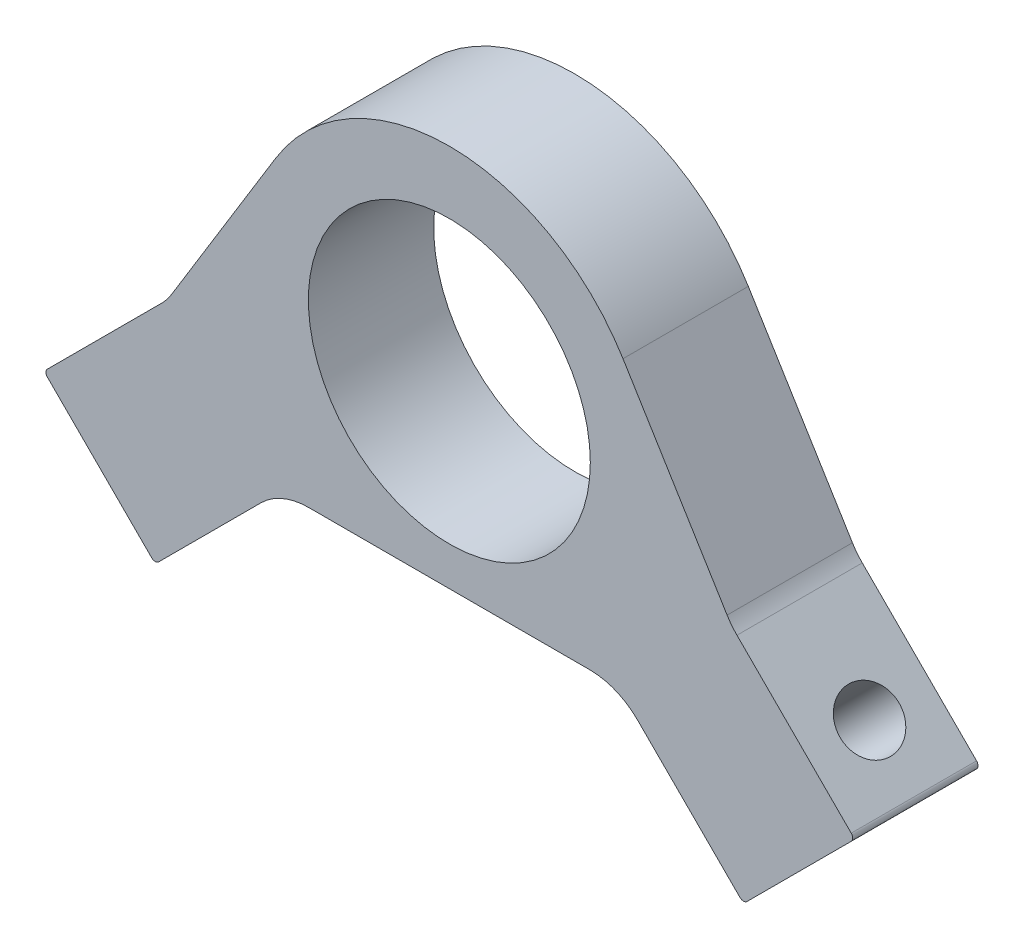
ISO-10303-21;
HEADER;
FILE_DESCRIPTION(('STEP AP214'),'2;1');
FILE_NAME('part.step','',(''),(''),'','','');
FILE_SCHEMA(('AUTOMOTIVE_DESIGN { 1 0 10303 214 1 1 1 1 }'));
ENDSEC;
DATA;
#1=APPLICATION_CONTEXT('core data for automotive mechanical design processes');
#2=APPLICATION_PROTOCOL_DEFINITION('international standard','automotive_design',2000,#1);
#3=PRODUCT_CONTEXT('',#1,'mechanical');
#4=PRODUCT('Part','Part','',(#3));
#5=PRODUCT_RELATED_PRODUCT_CATEGORY('part','',(#4));
#6=PRODUCT_DEFINITION_FORMATION('','',#4);
#7=PRODUCT_DEFINITION_CONTEXT('part definition',#1,'design');
#8=PRODUCT_DEFINITION('design','',#6,#7);
#9=PRODUCT_DEFINITION_SHAPE('','',#8);
#10=(LENGTH_UNIT() NAMED_UNIT(*) SI_UNIT(.MILLI.,.METRE.));
#11=(NAMED_UNIT(*) PLANE_ANGLE_UNIT() SI_UNIT($,.RADIAN.));
#12=(NAMED_UNIT(*) SI_UNIT($,.STERADIAN.) SOLID_ANGLE_UNIT());
#13=UNCERTAINTY_MEASURE_WITH_UNIT(LENGTH_MEASURE(1.E-05),#10,'distance_accuracy_value','');
#14=(GEOMETRIC_REPRESENTATION_CONTEXT(3) GLOBAL_UNCERTAINTY_ASSIGNED_CONTEXT((#13)) GLOBAL_UNIT_ASSIGNED_CONTEXT((#10,
#11,#12)) REPRESENTATION_CONTEXT('',''));
#15=CARTESIAN_POINT('',(0.,0.,0.));
#16=DIRECTION('',(0.,0.,1.));
#17=DIRECTION('',(1.,0.,0.));
#18=AXIS2_PLACEMENT_3D('',#15,#16,#17);
#19=CARTESIAN_POINT('',(-48.9671080151775,-44.583045971821,6.35));
#20=DIRECTION('',(-0.707106781186547,0.707106781186548,0.));
#21=DIRECTION('',(-0.707106781186548,-0.707106781186547,0.));
#22=AXIS2_PLACEMENT_3D('',#19,#20,#21);
#23=PLANE('',#22);
#24=CARTESIAN_POINT('',(-24.9617749006087,-20.5777128572523,0.));
#25=DIRECTION('',(-0.707106781186547,0.707106781186548,0.));
#26=DIRECTION('',(-0.707106781186548,-0.707106781186547,0.));
#27=AXIS2_PLACEMENT_3D('',#24,#25,#26);
#28=CIRCLE('',#27,2.99999999999998);
#29=CARTESIAN_POINT('',(-27.0830952441683,-22.6990332008119,0.));
#30=VERTEX_POINT('',#29);
#31=EDGE_CURVE('E216',#30,#30,#28,.T.);
#32=ORIENTED_EDGE('',*,*,#31,.T.);
#33=EDGE_LOOP('',(#32));
#34=FACE_BOUND('',#33,.T.);
#35=DIRECTION('',(0.707106781186548,0.707106781186547,0.));
#36=VECTOR('',#35,1.);
#37=CARTESIAN_POINT('',(-48.9671080151775,-44.583045971821,6.35));
#38=LINE('',#37,#36);
#39=CARTESIAN_POINT('',(-29.4519029611433,-25.0678409177868,6.35));
#40=VERTEX_POINT('',#39);
#41=CARTESIAN_POINT('',(-19.0927237379791,-14.7086616946226,6.35));
#42=VERTEX_POINT('',#41);
#43=EDGE_CURVE('E226',#40,#42,#38,.T.);
#44=ORIENTED_EDGE('',*,*,#43,.F.);
#45=DIRECTION('',(0.,0.,1.));
#46=VECTOR('',#45,1.);
#47=CARTESIAN_POINT('',(-29.4519029611433,-25.0678409177868,6.35));
#48=LINE('',#47,#46);
#49=CARTESIAN_POINT('',(-29.4519029611433,-25.0678409177868,-6.35));
#50=VERTEX_POINT('',#49);
#51=EDGE_CURVE('E41',#40,#50,#48,.F.);
#52=ORIENTED_EDGE('',*,*,#51,.T.);
#53=DIRECTION('',(0.707106781186548,0.707106781186547,0.));
#54=VECTOR('',#53,1.);
#55=CARTESIAN_POINT('',(-48.9671080151775,-44.583045971821,-6.35));
#56=LINE('',#55,#54);
#57=CARTESIAN_POINT('',(-19.0927237379791,-14.7086616946226,-6.35));
#58=VERTEX_POINT('',#57);
#59=EDGE_CURVE('E223',#50,#58,#56,.T.);
#60=ORIENTED_EDGE('',*,*,#59,.T.);
#61=DIRECTION('',(0.,0.,-1.));
#62=VECTOR('',#61,1.);
#63=CARTESIAN_POINT('',(-19.0927237379791,-14.7086616946227,6.35));
#64=LINE('',#63,#62);
#65=EDGE_CURVE('E267',#58,#42,#64,.F.);
#66=ORIENTED_EDGE('',*,*,#65,.T.);
#67=EDGE_LOOP('',(#44,#52,#60,#66));
#68=FACE_BOUND('',#67,.T.);
#69=ADVANCED_FACE('F33',(#34,#68),#23,.F.);
#70=CARTESIAN_POINT('',(-17.0840620433564,-12.7,6.35));
#71=DIRECTION('',(0.,1.,0.));
#72=DIRECTION('',(0.,0.,1.));
#73=AXIS2_PLACEMENT_3D('',#70,#71,#72);
#74=PLANE('',#73);
#75=DIRECTION('',(1.,0.,0.));
#76=VECTOR('',#75,1.);
#77=CARTESIAN_POINT('',(-17.0840620433564,-12.7,-6.35));
#78=LINE('',#77,#76);
#79=CARTESIAN_POINT('',(-14.2433854326017,-12.7,-6.35));
#80=VERTEX_POINT('',#79);
#81=CARTESIAN_POINT('',(14.2433854326017,-12.7,-6.35));
#82=VERTEX_POINT('',#81);
#83=EDGE_CURVE('E241',#80,#82,#78,.T.);
#84=ORIENTED_EDGE('',*,*,#83,.T.);
#85=DIRECTION('',(0.,0.,-1.));
#86=VECTOR('',#85,1.);
#87=CARTESIAN_POINT('',(14.2433854326017,-12.7,6.35));
#88=LINE('',#87,#86);
#89=CARTESIAN_POINT('',(14.2433854326017,-12.7,6.35));
#90=VERTEX_POINT('',#89);
#91=EDGE_CURVE('E265',#82,#90,#88,.F.);
#92=ORIENTED_EDGE('',*,*,#91,.T.);
#93=DIRECTION('',(1.,0.,0.));
#94=VECTOR('',#93,1.);
#95=CARTESIAN_POINT('',(-17.0840620433564,-12.7,6.35));
#96=LINE('',#95,#94);
#97=CARTESIAN_POINT('',(-14.2433854326017,-12.7,6.35));
#98=VERTEX_POINT('',#97);
#99=EDGE_CURVE('E228',#98,#90,#96,.T.);
#100=ORIENTED_EDGE('',*,*,#99,.F.);
#101=DIRECTION('',(0.,0.,-1.));
#102=VECTOR('',#101,1.);
#103=CARTESIAN_POINT('',(-14.2433854326017,-12.7,-6.35));
#104=LINE('',#103,#102);
#105=EDGE_CURVE('E262',#98,#80,#104,.T.);
#106=ORIENTED_EDGE('',*,*,#105,.T.);
#107=EDGE_LOOP('',(#84,#92,#100,#106));
#108=FACE_BOUND('',#107,.T.);
#109=ADVANCED_FACE('F370',(#108),#74,.F.);
#110=CARTESIAN_POINT('',(17.0840620433564,-12.7,6.35));
#111=DIRECTION('',(0.70710678118655,0.707106781186545,0.));
#112=DIRECTION('',(-0.707106781186545,0.70710678118655,0.));
#113=AXIS2_PLACEMENT_3D('',#110,#111,#112);
#114=PLANE('',#113);
#115=CARTESIAN_POINT('',(24.9617749006087,-20.5777128572523,0.));
#116=DIRECTION('',(0.70710678118655,0.707106781186545,0.));
#117=DIRECTION('',(-0.707106781186545,0.70710678118655,0.));
#118=AXIS2_PLACEMENT_3D('',#115,#116,#117);
#119=CIRCLE('',#118,2.99999999999998);
#120=CARTESIAN_POINT('',(22.840454557049,-18.4563925136927,0.));
#121=VERTEX_POINT('',#120);
#122=EDGE_CURVE('E200',#121,#121,#119,.T.);
#123=ORIENTED_EDGE('',*,*,#122,.T.);
#124=EDGE_LOOP('',(#123));
#125=FACE_BOUND('',#124,.T.);
#126=DIRECTION('',(0.707106781186545,-0.70710678118655,0.));
#127=VECTOR('',#126,1.);
#128=CARTESIAN_POINT('',(17.0840620433564,-12.7,-6.35));
#129=LINE('',#128,#127);
#130=CARTESIAN_POINT('',(19.0927237379791,-14.7086616946227,-6.35));
#131=VERTEX_POINT('',#130);
#132=CARTESIAN_POINT('',(29.4519029611432,-25.0678409177869,-6.35));
#133=VERTEX_POINT('',#132);
#134=EDGE_CURVE('E244',#131,#133,#129,.T.);
#135=ORIENTED_EDGE('',*,*,#134,.T.);
#136=DIRECTION('',(0.,0.,1.));
#137=VECTOR('',#136,1.);
#138=CARTESIAN_POINT('',(29.4519029611432,-25.0678409177869,6.35));
#139=LINE('',#138,#137);
#140=CARTESIAN_POINT('',(29.4519029611432,-25.0678409177869,6.35));
#141=VERTEX_POINT('',#140);
#142=EDGE_CURVE('E309',#133,#141,#139,.T.);
#143=ORIENTED_EDGE('',*,*,#142,.T.);
#144=DIRECTION('',(0.707106781186545,-0.70710678118655,0.));
#145=VECTOR('',#144,1.);
#146=CARTESIAN_POINT('',(17.0840620433564,-12.7,6.35));
#147=LINE('',#146,#145);
#148=CARTESIAN_POINT('',(19.0927237379791,-14.7086616946227,6.35));
#149=VERTEX_POINT('',#148);
#150=EDGE_CURVE('E232',#149,#141,#147,.T.);
#151=ORIENTED_EDGE('',*,*,#150,.F.);
#152=DIRECTION('',(0.,0.,-1.));
#153=VECTOR('',#152,1.);
#154=CARTESIAN_POINT('',(19.0927237379791,-14.7086616946227,-6.35));
#155=LINE('',#154,#153);
#156=EDGE_CURVE('E259',#149,#131,#155,.T.);
#157=ORIENTED_EDGE('',*,*,#156,.T.);
#158=EDGE_LOOP('',(#135,#143,#151,#157));
#159=FACE_BOUND('',#158,.T.);
#160=ADVANCED_FACE('F364',(#125,#159),#114,.F.);
#161=CARTESIAN_POINT('',(28.575,-1.63423163679252,6.35));
#162=DIRECTION('',(-0.707106781186549,-0.707106781186546,0.));
#163=DIRECTION('',(0.707106781186546,-0.707106781186549,0.));
#164=AXIS2_PLACEMENT_3D('',#161,#162,#163);
#165=PLANE('',#164);
#166=CARTESIAN_POINT('',(36.2401280605342,-9.2993596973268,0.));
#167=DIRECTION('',(0.707106781186549,0.707106781186546,0.));
#168=DIRECTION('',(-0.707106781186546,0.707106781186549,0.));
#169=AXIS2_PLACEMENT_3D('',#166,#167,#168);
#170=CIRCLE('',#169,2.99999999999999);
#171=CARTESIAN_POINT('',(34.1188077169746,-7.17803935376716,0.));
#172=VERTEX_POINT('',#171);
#173=EDGE_CURVE('E173',#172,#172,#170,.T.);
#174=ORIENTED_EDGE('',*,*,#173,.F.);
#175=EDGE_LOOP('',(#174));
#176=FACE_BOUND('',#175,.T.);
#177=DIRECTION('',(-0.707106781186546,0.707106781186549,0.));
#178=VECTOR('',#177,1.);
#179=CARTESIAN_POINT('',(28.575,-1.63423163679252,6.35));
#180=LINE('',#179,#178);
#181=CARTESIAN_POINT('',(40.7302561210688,-13.7894877578613,6.35));
#182=VERTEX_POINT('',#181);
#183=CARTESIAN_POINT('',(29.1496479245805,-2.20887956137306,6.35));
#184=VERTEX_POINT('',#183);
#185=EDGE_CURVE('E235',#182,#184,#180,.T.);
#186=ORIENTED_EDGE('',*,*,#185,.F.);
#187=DIRECTION('',(0.,0.,1.));
#188=VECTOR('',#187,1.);
#189=CARTESIAN_POINT('',(40.7302561210687,-13.7894877578613,6.35));
#190=LINE('',#189,#188);
#191=CARTESIAN_POINT('',(40.7302561210688,-13.7894877578613,-6.35));
#192=VERTEX_POINT('',#191);
#193=EDGE_CURVE('E300',#182,#192,#190,.F.);
#194=ORIENTED_EDGE('',*,*,#193,.T.);
#195=DIRECTION('',(-0.707106781186546,0.707106781186549,0.));
#196=VECTOR('',#195,1.);
#197=CARTESIAN_POINT('',(28.575,-1.63423163679252,-6.35));
#198=LINE('',#197,#196);
#199=CARTESIAN_POINT('',(29.1496479245805,-2.20887956137306,-6.35));
#200=VERTEX_POINT('',#199);
#201=EDGE_CURVE('E247',#192,#200,#198,.T.);
#202=ORIENTED_EDGE('',*,*,#201,.T.);
#203=DIRECTION('',(0.,0.,-1.));
#204=VECTOR('',#203,1.);
#205=CARTESIAN_POINT('',(29.1496479245805,-2.20887956137306,6.35));
#206=LINE('',#205,#204);
#207=EDGE_CURVE('E251',#200,#184,#206,.F.);
#208=ORIENTED_EDGE('',*,*,#207,.T.);
#209=EDGE_LOOP('',(#186,#194,#202,#208));
#210=FACE_BOUND('',#209,.T.);
#211=ADVANCED_FACE('F426',(#176,#210),#165,.F.);
#212=CARTESIAN_POINT('',(-60.2454611751029,-33.3046928118956,6.35));
#213=DIRECTION('',(0.707106781186549,-0.707106781186546,0.));
#214=DIRECTION('',(0.707106781186546,0.707106781186549,0.));
#215=AXIS2_PLACEMENT_3D('',#212,#213,#214);
#216=PLANE('',#215);
#217=CARTESIAN_POINT('',(-36.2401280605342,-9.2993596973268,0.));
#218=DIRECTION('',(-0.707106781186549,0.707106781186546,0.));
#219=DIRECTION('',(-0.707106781186546,-0.707106781186549,0.));
#220=AXIS2_PLACEMENT_3D('',#217,#218,#219);
#221=CIRCLE('',#220,2.99999999999999);
#222=CARTESIAN_POINT('',(-38.3614484040938,-11.4206800408864,0.));
#223=VERTEX_POINT('',#222);
#224=EDGE_CURVE('E210',#223,#223,#221,.T.);
#225=ORIENTED_EDGE('',*,*,#224,.F.);
#226=EDGE_LOOP('',(#225));
#227=FACE_BOUND('',#226,.T.);
#228=DIRECTION('',(-0.707106781186546,-0.707106781186549,0.));
#229=VECTOR('',#228,1.);
#230=CARTESIAN_POINT('',(-60.2454611751029,-33.3046928118956,-6.35));
#231=LINE('',#230,#229);
#232=CARTESIAN_POINT('',(-29.1496479245805,-2.20887956137305,-6.35));
#233=VERTEX_POINT('',#232);
#234=CARTESIAN_POINT('',(-40.7302561210687,-13.7894877578614,-6.35));
#235=VERTEX_POINT('',#234);
#236=EDGE_CURVE('E229',#233,#235,#231,.T.);
#237=ORIENTED_EDGE('',*,*,#236,.T.);
#238=DIRECTION('',(0.,0.,1.));
#239=VECTOR('',#238,1.);
#240=CARTESIAN_POINT('',(-40.7302561210687,-13.7894877578614,6.35));
#241=LINE('',#240,#239);
#242=CARTESIAN_POINT('',(-40.7302561210687,-13.7894877578614,6.35));
#243=VERTEX_POINT('',#242);
#244=EDGE_CURVE('E11',#235,#243,#241,.T.);
#245=ORIENTED_EDGE('',*,*,#244,.T.);
#246=DIRECTION('',(-0.707106781186546,-0.707106781186549,0.));
#247=VECTOR('',#246,1.);
#248=CARTESIAN_POINT('',(-60.2454611751029,-33.3046928118956,6.35));
#249=LINE('',#248,#247);
#250=CARTESIAN_POINT('',(-29.1496479245805,-2.20887956137305,6.35));
#251=VERTEX_POINT('',#250);
#252=EDGE_CURVE('E237',#251,#243,#249,.T.);
#253=ORIENTED_EDGE('',*,*,#252,.F.);
#254=DIRECTION('',(0.,0.,-1.));
#255=VECTOR('',#254,1.);
#256=CARTESIAN_POINT('',(-29.1496479245804,-2.20887956137304,-6.35));
#257=LINE('',#256,#255);
#258=EDGE_CURVE('E254',#251,#233,#257,.T.);
#259=ORIENTED_EDGE('',*,*,#258,.T.);
#260=EDGE_LOOP('',(#237,#245,#253,#259));
#261=FACE_BOUND('',#260,.T.);
#262=ADVANCED_FACE('F334',(#227,#261),#216,.F.);
#263=CARTESIAN_POINT('',(0.,0.,6.35));
#264=DIRECTION('',(0.,0.,-1.));
#265=DIRECTION('',(-1.,0.,0.));
#266=AXIS2_PLACEMENT_3D('',#263,#264,#265);
#267=PLANE('',#266);
#268=CARTESIAN_POINT('',(1.49533163629201E-12,5.50951836320775,6.35));
#269=DIRECTION('',(0.,0.,1.));
#270=DIRECTION('',(1.,0.,0.));
#271=AXIS2_PLACEMENT_3D('',#268,#269,#270);
#272=CIRCLE('',#271,14.2875);
#273=CARTESIAN_POINT('',(14.2875000000015,5.50951836320775,6.35));
#274=VERTEX_POINT('',#273);
#275=EDGE_CURVE('E219',#274,#274,#272,.T.);
#276=ORIENTED_EDGE('',*,*,#275,.F.);
#277=EDGE_LOOP('',(#276));
#278=FACE_BOUND('',#277,.T.);
#279=DIRECTION('',(-0.707106781186547,-0.707106781186548,0.));
#280=VECTOR('',#279,1.);
#281=CARTESIAN_POINT('',(29.811113205986,-25.4270511626296,6.35));
#282=LINE('',#281,#280);
#283=CARTESIAN_POINT('',(40.7302561210687,-14.5079082475469,6.35));
#284=VERTEX_POINT('',#283);
#285=CARTESIAN_POINT('',(30.1703234508287,-25.0678409177869,6.35));
#286=VERTEX_POINT('',#285);
#287=EDGE_CURVE('E203',#284,#286,#282,.T.);
#288=ORIENTED_EDGE('',*,*,#287,.F.);
#289=CARTESIAN_POINT('',(40.371045876226,-14.1486980027041,6.35));
#290=DIRECTION('',(0.,0.,-1.));
#291=DIRECTION('',(-1.,0.,0.));
#292=AXIS2_PLACEMENT_3D('',#289,#290,#291);
#293=CIRCLE('',#292,0.508);
#294=EDGE_CURVE('E298',#284,#182,#293,.F.);
#295=ORIENTED_EDGE('',*,*,#294,.T.);
#296=ORIENTED_EDGE('',*,*,#185,.T.);
#297=CARTESIAN_POINT('',(33.9989862299579,2.64045874400427,6.35));
#298=DIRECTION('',(0.,0.,-1.));
#299=DIRECTION('',(-1.,0.,0.));
#300=AXIS2_PLACEMENT_3D('',#297,#298,#299);
#301=CIRCLE('',#300,6.858);
#302=CARTESIAN_POINT('',(28.1505732712878,-0.941193090674731,6.35));
#303=VERTEX_POINT('',#302);
#304=EDGE_CURVE('E272',#184,#303,#301,.T.);
#305=ORIENTED_EDGE('',*,*,#304,.T.);
#306=DIRECTION('',(0.522258943522748,-0.852786958102962,0.));
#307=VECTOR('',#306,1.);
#308=CARTESIAN_POINT('',(17.5993908478514,16.2876373101585,6.35));
#309=LINE('',#308,#307);
#310=CARTESIAN_POINT('',(17.5993908478514,16.2876373101585,6.35));
#311=VERTEX_POINT('',#310);
#312=EDGE_CURVE('E190',#311,#303,#309,.T.);
#313=ORIENTED_EDGE('',*,*,#312,.F.);
#314=CARTESIAN_POINT('',(1.49533163629201E-12,5.50951836320775,6.35));
#315=DIRECTION('',(0.,0.,-1.));
#316=DIRECTION('',(1.,0.,0.));
#317=AXIS2_PLACEMENT_3D('',#314,#315,#316);
#318=CIRCLE('',#317,20.6375);
#319=CARTESIAN_POINT('',(-17.599390847847,16.2876373101607,6.35));
#320=VERTEX_POINT('',#319);
#321=EDGE_CURVE('E169',#320,#311,#318,.T.);
#322=ORIENTED_EDGE('',*,*,#321,.F.);
#323=DIRECTION('',(0.522258943522854,0.852786958102897,0.));
#324=VECTOR('',#323,1.);
#325=CARTESIAN_POINT('',(-28.575,-1.6342316367926,6.35));
#326=LINE('',#325,#324);
#327=CARTESIAN_POINT('',(-28.1505732712881,-0.941193090675432,6.35));
#328=VERTEX_POINT('',#327);
#329=EDGE_CURVE('E193',#328,#320,#326,.T.);
#330=ORIENTED_EDGE('',*,*,#329,.F.);
#331=CARTESIAN_POINT('',(-33.9989862299578,2.6404587440043,6.35));
#332=DIRECTION('',(0.,0.,-1.));
#333=DIRECTION('',(-1.,0.,0.));
#334=AXIS2_PLACEMENT_3D('',#331,#332,#333);
#335=CIRCLE('',#334,6.858);
#336=EDGE_CURVE('E276',#328,#251,#335,.T.);
#337=ORIENTED_EDGE('',*,*,#336,.T.);
#338=ORIENTED_EDGE('',*,*,#252,.T.);
#339=CARTESIAN_POINT('',(-40.371045876226,-14.1486980027041,6.35));
#340=DIRECTION('',(0.,0.,-1.));
#341=DIRECTION('',(-1.,0.,0.));
#342=AXIS2_PLACEMENT_3D('',#339,#340,#341);
#343=CIRCLE('',#342,0.508);
#344=CARTESIAN_POINT('',(-40.7302561210687,-14.5079082475469,6.35));
#345=VERTEX_POINT('',#344);
#346=EDGE_CURVE('E292',#243,#345,#343,.F.);
#347=ORIENTED_EDGE('',*,*,#346,.T.);
#348=DIRECTION('',(-0.707106781186548,0.707106781186547,0.));
#349=VECTOR('',#348,1.);
#350=CARTESIAN_POINT('',(-41.0894663659115,-14.1486980027041,6.35));
#351=LINE('',#350,#349);
#352=CARTESIAN_POINT('',(-30.1703234508288,-25.0678409177868,6.35));
#353=VERTEX_POINT('',#352);
#354=EDGE_CURVE('E208',#353,#345,#351,.T.);
#355=ORIENTED_EDGE('',*,*,#354,.F.);
#356=CARTESIAN_POINT('',(-29.811113205986,-24.7086306729441,6.35));
#357=DIRECTION('',(0.,0.,-1.));
#358=DIRECTION('',(-1.,0.,0.));
#359=AXIS2_PLACEMENT_3D('',#356,#357,#358);
#360=CIRCLE('',#359,0.508);
#361=EDGE_CURVE('E294',#353,#40,#360,.F.);
#362=ORIENTED_EDGE('',*,*,#361,.T.);
#363=ORIENTED_EDGE('',*,*,#43,.T.);
#364=CARTESIAN_POINT('',(-14.2433854326017,-19.558,6.35));
#365=DIRECTION('',(0.,0.,-1.));
#366=DIRECTION('',(-1.,0.,0.));
#367=AXIS2_PLACEMENT_3D('',#364,#365,#366);
#368=CIRCLE('',#367,6.858);
#369=EDGE_CURVE('E285',#42,#98,#368,.T.);
#370=ORIENTED_EDGE('',*,*,#369,.T.);
#371=ORIENTED_EDGE('',*,*,#99,.T.);
#372=CARTESIAN_POINT('',(14.2433854326017,-19.558,6.35));
#373=DIRECTION('',(0.,0.,-1.));
#374=DIRECTION('',(-1.,0.,0.));
#375=AXIS2_PLACEMENT_3D('',#372,#373,#374);
#376=CIRCLE('',#375,6.858);
#377=EDGE_CURVE('E280',#90,#149,#376,.T.);
#378=ORIENTED_EDGE('',*,*,#377,.T.);
#379=ORIENTED_EDGE('',*,*,#150,.T.);
#380=CARTESIAN_POINT('',(29.811113205986,-24.7086306729441,6.35));
#381=DIRECTION('',(0.,0.,-1.));
#382=DIRECTION('',(-1.,0.,0.));
#383=AXIS2_PLACEMENT_3D('',#380,#381,#382);
#384=CIRCLE('',#383,0.508);
#385=EDGE_CURVE('E296',#141,#286,#384,.F.);
#386=ORIENTED_EDGE('',*,*,#385,.T.);
#387=EDGE_LOOP('',(#288,#295,#296,#305,#313,#322,#330,#337,#338,#347,#355,#362,#363,#370,#371,
#378,#379,#386));
#388=FACE_BOUND('',#387,.T.);
#389=ADVANCED_FACE('F329',(#278,#388),#267,.F.);
#390=CARTESIAN_POINT('',(0.,0.,-6.35));
#391=DIRECTION('',(0.,0.,-1.));
#392=DIRECTION('',(-1.,0.,0.));
#393=AXIS2_PLACEMENT_3D('',#390,#391,#392);
#394=PLANE('',#393);
#395=ORIENTED_EDGE('',*,*,#201,.F.);
#396=CARTESIAN_POINT('',(40.371045876226,-14.1486980027041,-6.35));
#397=DIRECTION('',(0.,0.,-1.));
#398=DIRECTION('',(-1.,0.,0.));
#399=AXIS2_PLACEMENT_3D('',#396,#397,#398);
#400=CIRCLE('',#399,0.508);
#401=CARTESIAN_POINT('',(40.7302561210687,-14.5079082475469,-6.35));
#402=VERTEX_POINT('',#401);
#403=EDGE_CURVE('E307',#192,#402,#400,.T.);
#404=ORIENTED_EDGE('',*,*,#403,.T.);
#405=DIRECTION('',(-0.707106781186547,-0.707106781186548,0.));
#406=VECTOR('',#405,1.);
#407=CARTESIAN_POINT('',(29.811113205986,-25.4270511626296,-6.35));
#408=LINE('',#407,#406);
#409=CARTESIAN_POINT('',(30.1703234508287,-25.0678409177869,-6.35));
#410=VERTEX_POINT('',#409);
#411=EDGE_CURVE('E204',#402,#410,#408,.T.);
#412=ORIENTED_EDGE('',*,*,#411,.T.);
#413=CARTESIAN_POINT('',(29.811113205986,-24.7086306729441,-6.35));
#414=DIRECTION('',(0.,0.,-1.));
#415=DIRECTION('',(-1.,0.,0.));
#416=AXIS2_PLACEMENT_3D('',#413,#414,#415);
#417=CIRCLE('',#416,0.508);
#418=EDGE_CURVE('E305',#410,#133,#417,.T.);
#419=ORIENTED_EDGE('',*,*,#418,.T.);
#420=ORIENTED_EDGE('',*,*,#134,.F.);
#421=CARTESIAN_POINT('',(14.2433854326017,-19.558,-6.35));
#422=DIRECTION('',(0.,0.,-1.));
#423=DIRECTION('',(-1.,0.,0.));
#424=AXIS2_PLACEMENT_3D('',#421,#422,#423);
#425=CIRCLE('',#424,6.858);
#426=EDGE_CURVE('E278',#131,#82,#425,.F.);
#427=ORIENTED_EDGE('',*,*,#426,.T.);
#428=ORIENTED_EDGE('',*,*,#83,.F.);
#429=CARTESIAN_POINT('',(-14.2433854326017,-19.558,-6.35));
#430=DIRECTION('',(0.,0.,-1.));
#431=DIRECTION('',(-1.,0.,0.));
#432=AXIS2_PLACEMENT_3D('',#429,#430,#431);
#433=CIRCLE('',#432,6.858);
#434=EDGE_CURVE('E282',#80,#58,#433,.F.);
#435=ORIENTED_EDGE('',*,*,#434,.T.);
#436=ORIENTED_EDGE('',*,*,#59,.F.);
#437=CARTESIAN_POINT('',(-29.811113205986,-24.7086306729441,-6.35));
#438=DIRECTION('',(0.,0.,-1.));
#439=DIRECTION('',(-1.,0.,0.));
#440=AXIS2_PLACEMENT_3D('',#437,#438,#439);
#441=CIRCLE('',#440,0.508);
#442=CARTESIAN_POINT('',(-30.1703234508288,-25.0678409177868,-6.35));
#443=VERTEX_POINT('',#442);
#444=EDGE_CURVE('E303',#50,#443,#441,.T.);
#445=ORIENTED_EDGE('',*,*,#444,.T.);
#446=DIRECTION('',(-0.707106781186548,0.707106781186547,0.));
#447=VECTOR('',#446,1.);
#448=CARTESIAN_POINT('',(-41.0894663659115,-14.1486980027041,-6.35));
#449=LINE('',#448,#447);
#450=CARTESIAN_POINT('',(-40.7302561210687,-14.5079082475469,-6.35));
#451=VERTEX_POINT('',#450);
#452=EDGE_CURVE('E207',#443,#451,#449,.T.);
#453=ORIENTED_EDGE('',*,*,#452,.T.);
#454=CARTESIAN_POINT('',(-40.371045876226,-14.1486980027041,-6.35));
#455=DIRECTION('',(0.,0.,-1.));
#456=DIRECTION('',(-1.,0.,0.));
#457=AXIS2_PLACEMENT_3D('',#454,#455,#456);
#458=CIRCLE('',#457,0.508);
#459=EDGE_CURVE('E48',#451,#235,#458,.T.);
#460=ORIENTED_EDGE('',*,*,#459,.T.);
#461=ORIENTED_EDGE('',*,*,#236,.F.);
#462=CARTESIAN_POINT('',(-33.9989862299578,2.6404587440043,-6.35));
#463=DIRECTION('',(0.,0.,-1.));
#464=DIRECTION('',(-1.,0.,0.));
#465=AXIS2_PLACEMENT_3D('',#462,#463,#464);
#466=CIRCLE('',#465,6.858);
#467=CARTESIAN_POINT('',(-28.1505732712881,-0.941193090675432,-6.35));
#468=VERTEX_POINT('',#467);
#469=EDGE_CURVE('E274',#233,#468,#466,.F.);
#470=ORIENTED_EDGE('',*,*,#469,.T.);
#471=DIRECTION('',(0.522258943522854,0.852786958102897,0.));
#472=VECTOR('',#471,1.);
#473=CARTESIAN_POINT('',(-28.575,-1.6342316367926,-6.35));
#474=LINE('',#473,#472);
#475=CARTESIAN_POINT('',(-17.5993908478471,16.2876373101607,-6.35));
#476=VERTEX_POINT('',#475);
#477=EDGE_CURVE('E188',#468,#476,#474,.T.);
#478=ORIENTED_EDGE('',*,*,#477,.T.);
#479=CARTESIAN_POINT('',(1.49533163629201E-12,5.50951836320775,-6.35));
#480=DIRECTION('',(0.,0.,-1.));
#481=DIRECTION('',(1.,0.,0.));
#482=AXIS2_PLACEMENT_3D('',#479,#480,#481);
#483=CIRCLE('',#482,20.6375);
#484=CARTESIAN_POINT('',(17.5993908478514,16.2876373101585,-6.35));
#485=VERTEX_POINT('',#484);
#486=EDGE_CURVE('E166',#476,#485,#483,.T.);
#487=ORIENTED_EDGE('',*,*,#486,.T.);
#488=DIRECTION('',(0.522258943522748,-0.852786958102962,0.));
#489=VECTOR('',#488,1.);
#490=CARTESIAN_POINT('',(17.5993908478514,16.2876373101585,-6.35));
#491=LINE('',#490,#489);
#492=CARTESIAN_POINT('',(28.1505732712878,-0.941193090674731,-6.35));
#493=VERTEX_POINT('',#492);
#494=EDGE_CURVE('E178',#485,#493,#491,.T.);
#495=ORIENTED_EDGE('',*,*,#494,.T.);
#496=CARTESIAN_POINT('',(33.9989862299579,2.64045874400427,-6.35));
#497=DIRECTION('',(0.,0.,-1.));
#498=DIRECTION('',(-1.,0.,0.));
#499=AXIS2_PLACEMENT_3D('',#496,#497,#498);
#500=CIRCLE('',#499,6.858);
#501=EDGE_CURVE('E270',#493,#200,#500,.F.);
#502=ORIENTED_EDGE('',*,*,#501,.T.);
#503=EDGE_LOOP('',(#395,#404,#412,#419,#420,#427,#428,#435,#436,#445,#453,#460,#461,#470,#478,
#487,#495,#502));
#504=FACE_BOUND('',#503,.T.);
#505=CARTESIAN_POINT('',(1.49533163629201E-12,5.50951836320775,-6.35));
#506=DIRECTION('',(0.,0.,1.));
#507=DIRECTION('',(1.,0.,0.));
#508=AXIS2_PLACEMENT_3D('',#505,#506,#507);
#509=CIRCLE('',#508,14.2875);
#510=CARTESIAN_POINT('',(14.2875000000015,5.50951836320775,-6.35));
#511=VERTEX_POINT('',#510);
#512=EDGE_CURVE('E220',#511,#511,#509,.T.);
#513=ORIENTED_EDGE('',*,*,#512,.T.);
#514=EDGE_LOOP('',(#513));
#515=FACE_BOUND('',#514,.T.);
#516=ADVANCED_FACE('F185',(#504,#515),#394,.T.);
#517=CARTESIAN_POINT('',(1.49533163629201E-12,5.50951836320775,-6.35));
#518=DIRECTION('',(0.,0.,1.));
#519=DIRECTION('',(1.,0.,0.));
#520=AXIS2_PLACEMENT_3D('',#517,#518,#519);
#521=CYLINDRICAL_SURFACE('',#520,14.2875);
#522=ORIENTED_EDGE('',*,*,#512,.F.);
#523=EDGE_LOOP('',(#522));
#524=FACE_BOUND('',#523,.T.);
#525=ORIENTED_EDGE('',*,*,#275,.T.);
#526=EDGE_LOOP('',(#525));
#527=FACE_BOUND('',#526,.T.);
#528=ADVANCED_FACE('F462',(#524,#527),#521,.F.);
#529=CARTESIAN_POINT('',(-36.2401280605342,-9.2993596973268,0.));
#530=DIRECTION('',(-0.707106781186549,0.707106781186546,0.));
#531=DIRECTION('',(-0.707106781186546,-0.707106781186549,0.));
#532=AXIS2_PLACEMENT_3D('',#529,#530,#531);
#533=CYLINDRICAL_SURFACE('',#532,2.99999999999998);
#534=ORIENTED_EDGE('',*,*,#224,.T.);
#535=EDGE_LOOP('',(#534));
#536=FACE_BOUND('',#535,.T.);
#537=ORIENTED_EDGE('',*,*,#31,.F.);
#538=EDGE_LOOP('',(#537));
#539=FACE_BOUND('',#538,.T.);
#540=ADVANCED_FACE('F473',(#536,#539),#533,.F.);
#541=CARTESIAN_POINT('',(29.811113205986,-25.4270511626296,-6.35));
#542=DIRECTION('',(-0.707106781186548,0.707106781186547,0.));
#543=DIRECTION('',(-0.707106781186547,-0.707106781186548,0.));
#544=AXIS2_PLACEMENT_3D('',#541,#542,#543);
#545=PLANE('',#544);
#546=ORIENTED_EDGE('',*,*,#411,.F.);
#547=DIRECTION('',(0.,0.,1.));
#548=VECTOR('',#547,1.);
#549=CARTESIAN_POINT('',(40.7302561210687,-14.5079082475469,-6.35));
#550=LINE('',#549,#548);
#551=EDGE_CURVE('E289',#402,#284,#550,.T.);
#552=ORIENTED_EDGE('',*,*,#551,.T.);
#553=ORIENTED_EDGE('',*,*,#287,.T.);
#554=DIRECTION('',(0.,0.,1.));
#555=VECTOR('',#554,1.);
#556=CARTESIAN_POINT('',(30.1703234508287,-25.0678409177869,-6.35));
#557=LINE('',#556,#555);
#558=EDGE_CURVE('E287',#286,#410,#557,.F.);
#559=ORIENTED_EDGE('',*,*,#558,.T.);
#560=EDGE_LOOP('',(#546,#552,#553,#559));
#561=FACE_BOUND('',#560,.T.);
#562=ADVANCED_FACE('F355',(#561),#545,.F.);
#563=CARTESIAN_POINT('',(-41.0894663659115,-14.1486980027041,-6.35));
#564=DIRECTION('',(0.707106781186547,0.707106781186548,0.));
#565=DIRECTION('',(-0.707106781186548,0.707106781186547,0.));
#566=AXIS2_PLACEMENT_3D('',#563,#564,#565);
#567=PLANE('',#566);
#568=ORIENTED_EDGE('',*,*,#452,.F.);
#569=DIRECTION('',(0.,0.,1.));
#570=VECTOR('',#569,1.);
#571=CARTESIAN_POINT('',(-30.1703234508288,-25.0678409177868,-6.35));
#572=LINE('',#571,#570);
#573=EDGE_CURVE('E313',#443,#353,#572,.T.);
#574=ORIENTED_EDGE('',*,*,#573,.T.);
#575=ORIENTED_EDGE('',*,*,#354,.T.);
#576=DIRECTION('',(0.,0.,1.));
#577=VECTOR('',#576,1.);
#578=CARTESIAN_POINT('',(-40.7302561210687,-14.5079082475469,-6.35));
#579=LINE('',#578,#577);
#580=EDGE_CURVE('E56',#345,#451,#579,.F.);
#581=ORIENTED_EDGE('',*,*,#580,.T.);
#582=EDGE_LOOP('',(#568,#574,#575,#581));
#583=FACE_BOUND('',#582,.T.);
#584=ADVANCED_FACE('F326',(#583),#567,.F.);
#585=CARTESIAN_POINT('',(36.2401280605342,-9.2993596973268,0.));
#586=DIRECTION('',(0.707106781186549,0.707106781186546,0.));
#587=DIRECTION('',(-0.707106781186546,0.707106781186549,0.));
#588=AXIS2_PLACEMENT_3D('',#585,#586,#587);
#589=CYLINDRICAL_SURFACE('',#588,2.99999999999998);
#590=ORIENTED_EDGE('',*,*,#173,.T.);
#591=EDGE_LOOP('',(#590));
#592=FACE_BOUND('',#591,.T.);
#593=ORIENTED_EDGE('',*,*,#122,.F.);
#594=EDGE_LOOP('',(#593));
#595=FACE_BOUND('',#594,.T.);
#596=ADVANCED_FACE('F484',(#592,#595),#589,.F.);
#597=CARTESIAN_POINT('',(17.5993908478514,16.2876373101585,-6.35));
#598=DIRECTION('',(-0.852786958102962,-0.522258943522748,0.));
#599=DIRECTION('',(0.522258943522748,-0.852786958102962,0.));
#600=AXIS2_PLACEMENT_3D('',#597,#598,#599);
#601=PLANE('',#600);
#602=ORIENTED_EDGE('',*,*,#312,.T.);
#603=DIRECTION('',(0.,0.,-1.));
#604=VECTOR('',#603,1.);
#605=CARTESIAN_POINT('',(28.1505732712878,-0.941193090674736,-6.35));
#606=LINE('',#605,#604);
#607=EDGE_CURVE('E181',#303,#493,#606,.T.);
#608=ORIENTED_EDGE('',*,*,#607,.T.);
#609=ORIENTED_EDGE('',*,*,#494,.F.);
#610=DIRECTION('',(0.,0.,1.));
#611=VECTOR('',#610,1.);
#612=CARTESIAN_POINT('',(17.5993908478514,16.2876373101585,-6.35));
#613=LINE('',#612,#611);
#614=EDGE_CURVE('E161',#485,#311,#613,.T.);
#615=ORIENTED_EDGE('',*,*,#614,.T.);
#616=EDGE_LOOP('',(#602,#608,#609,#615));
#617=FACE_BOUND('',#616,.T.);
#618=ADVANCED_FACE('F179',(#617),#601,.F.);
#619=CARTESIAN_POINT('',(1.49533163629201E-12,5.50951836320775,-6.35));
#620=DIRECTION('',(0.,0.,1.));
#621=DIRECTION('',(1.,0.,0.));
#622=AXIS2_PLACEMENT_3D('',#619,#620,#621);
#623=CYLINDRICAL_SURFACE('',#622,20.6375);
#624=ORIENTED_EDGE('',*,*,#321,.T.);
#625=ORIENTED_EDGE('',*,*,#614,.F.);
#626=ORIENTED_EDGE('',*,*,#486,.F.);
#627=DIRECTION('',(0.,0.,1.));
#628=VECTOR('',#627,1.);
#629=CARTESIAN_POINT('',(-17.599390847847,16.2876373101607,-6.35));
#630=LINE('',#629,#628);
#631=EDGE_CURVE('E174',#476,#320,#630,.T.);
#632=ORIENTED_EDGE('',*,*,#631,.T.);
#633=EDGE_LOOP('',(#624,#625,#626,#632));
#634=FACE_BOUND('',#633,.T.);
#635=ADVANCED_FACE('F163',(#634),#623,.T.);
#636=CARTESIAN_POINT('',(-28.575,-1.6342316367926,-6.35));
#637=DIRECTION('',(0.852786958102897,-0.522258943522854,0.));
#638=DIRECTION('',(0.522258943522854,0.852786958102897,0.));
#639=AXIS2_PLACEMENT_3D('',#636,#637,#638);
#640=PLANE('',#639);
#641=ORIENTED_EDGE('',*,*,#477,.F.);
#642=DIRECTION('',(0.,0.,-1.));
#643=VECTOR('',#642,1.);
#644=CARTESIAN_POINT('',(-28.1505732712881,-0.941193090675432,6.35));
#645=LINE('',#644,#643);
#646=EDGE_CURVE('E257',#468,#328,#645,.F.);
#647=ORIENTED_EDGE('',*,*,#646,.T.);
#648=ORIENTED_EDGE('',*,*,#329,.T.);
#649=ORIENTED_EDGE('',*,*,#631,.F.);
#650=EDGE_LOOP('',(#641,#647,#648,#649));
#651=FACE_BOUND('',#650,.T.);
#652=ADVANCED_FACE('F339',(#651),#640,.F.);
#653=CARTESIAN_POINT('',(33.9989862299579,2.64045874400427,-6.35));
#654=DIRECTION('',(0.,0.,1.));
#655=DIRECTION('',(1.,0.,0.));
#656=AXIS2_PLACEMENT_3D('',#653,#654,#655);
#657=CYLINDRICAL_SURFACE('',#656,6.858);
#658=ORIENTED_EDGE('',*,*,#304,.F.);
#659=ORIENTED_EDGE('',*,*,#207,.F.);
#660=ORIENTED_EDGE('',*,*,#501,.F.);
#661=ORIENTED_EDGE('',*,*,#607,.F.);
#662=EDGE_LOOP('',(#658,#659,#660,#661));
#663=FACE_BOUND('',#662,.T.);
#664=ADVANCED_FACE('F345',(#663),#657,.F.);
#665=CARTESIAN_POINT('',(-33.9989862299578,2.6404587440043,6.35));
#666=DIRECTION('',(0.,0.,1.));
#667=DIRECTION('',(1.,0.,0.));
#668=AXIS2_PLACEMENT_3D('',#665,#666,#667);
#669=CYLINDRICAL_SURFACE('',#668,6.858);
#670=ORIENTED_EDGE('',*,*,#336,.F.);
#671=ORIENTED_EDGE('',*,*,#646,.F.);
#672=ORIENTED_EDGE('',*,*,#469,.F.);
#673=ORIENTED_EDGE('',*,*,#258,.F.);
#674=EDGE_LOOP('',(#670,#671,#672,#673));
#675=FACE_BOUND('',#674,.T.);
#676=ADVANCED_FACE('F342',(#675),#669,.F.);
#677=CARTESIAN_POINT('',(14.2433854326017,-19.558,6.35));
#678=DIRECTION('',(0.,0.,1.));
#679=DIRECTION('',(1.,0.,0.));
#680=AXIS2_PLACEMENT_3D('',#677,#678,#679);
#681=CYLINDRICAL_SURFACE('',#680,6.858);
#682=ORIENTED_EDGE('',*,*,#377,.F.);
#683=ORIENTED_EDGE('',*,*,#91,.F.);
#684=ORIENTED_EDGE('',*,*,#426,.F.);
#685=ORIENTED_EDGE('',*,*,#156,.F.);
#686=EDGE_LOOP('',(#682,#683,#684,#685));
#687=FACE_BOUND('',#686,.T.);
#688=ADVANCED_FACE('F374',(#687),#681,.F.);
#689=CARTESIAN_POINT('',(-14.2433854326017,-19.558,6.35));
#690=DIRECTION('',(0.,0.,1.));
#691=DIRECTION('',(1.,0.,0.));
#692=AXIS2_PLACEMENT_3D('',#689,#690,#691);
#693=CYLINDRICAL_SURFACE('',#692,6.858);
#694=ORIENTED_EDGE('',*,*,#369,.F.);
#695=ORIENTED_EDGE('',*,*,#65,.F.);
#696=ORIENTED_EDGE('',*,*,#434,.F.);
#697=ORIENTED_EDGE('',*,*,#105,.F.);
#698=EDGE_LOOP('',(#694,#695,#696,#697));
#699=FACE_BOUND('',#698,.T.);
#700=ADVANCED_FACE('F377',(#699),#693,.F.);
#701=CARTESIAN_POINT('',(40.371045876226,-14.1486980027041,-6.35));
#702=DIRECTION('',(0.,0.,1.));
#703=DIRECTION('',(1.,0.,0.));
#704=AXIS2_PLACEMENT_3D('',#701,#702,#703);
#705=CYLINDRICAL_SURFACE('',#704,0.508);
#706=ORIENTED_EDGE('',*,*,#403,.F.);
#707=ORIENTED_EDGE('',*,*,#193,.F.);
#708=ORIENTED_EDGE('',*,*,#294,.F.);
#709=ORIENTED_EDGE('',*,*,#551,.F.);
#710=EDGE_LOOP('',(#706,#707,#708,#709));
#711=FACE_BOUND('',#710,.T.);
#712=ADVANCED_FACE('F353',(#711),#705,.T.);
#713=CARTESIAN_POINT('',(29.811113205986,-24.7086306729441,6.35));
#714=DIRECTION('',(0.,0.,1.));
#715=DIRECTION('',(1.,0.,0.));
#716=AXIS2_PLACEMENT_3D('',#713,#714,#715);
#717=CYLINDRICAL_SURFACE('',#716,0.508);
#718=ORIENTED_EDGE('',*,*,#418,.F.);
#719=ORIENTED_EDGE('',*,*,#558,.F.);
#720=ORIENTED_EDGE('',*,*,#385,.F.);
#721=ORIENTED_EDGE('',*,*,#142,.F.);
#722=EDGE_LOOP('',(#718,#719,#720,#721));
#723=FACE_BOUND('',#722,.T.);
#724=ADVANCED_FACE('F362',(#723),#717,.T.);
#725=CARTESIAN_POINT('',(-29.811113205986,-24.7086306729441,-6.35));
#726=DIRECTION('',(0.,0.,1.));
#727=DIRECTION('',(1.,0.,0.));
#728=AXIS2_PLACEMENT_3D('',#725,#726,#727);
#729=CYLINDRICAL_SURFACE('',#728,0.508);
#730=ORIENTED_EDGE('',*,*,#444,.F.);
#731=ORIENTED_EDGE('',*,*,#51,.F.);
#732=ORIENTED_EDGE('',*,*,#361,.F.);
#733=ORIENTED_EDGE('',*,*,#573,.F.);
#734=EDGE_LOOP('',(#730,#731,#732,#733));
#735=FACE_BOUND('',#734,.T.);
#736=ADVANCED_FACE('F324',(#735),#729,.T.);
#737=CARTESIAN_POINT('',(-40.371045876226,-14.1486980027041,6.35));
#738=DIRECTION('',(0.,0.,1.));
#739=DIRECTION('',(1.,0.,0.));
#740=AXIS2_PLACEMENT_3D('',#737,#738,#739);
#741=CYLINDRICAL_SURFACE('',#740,0.508);
#742=ORIENTED_EDGE('',*,*,#459,.F.);
#743=ORIENTED_EDGE('',*,*,#580,.F.);
#744=ORIENTED_EDGE('',*,*,#346,.F.);
#745=ORIENTED_EDGE('',*,*,#244,.F.);
#746=EDGE_LOOP('',(#742,#743,#744,#745));
#747=FACE_BOUND('',#746,.T.);
#748=ADVANCED_FACE('F35',(#747),#741,.T.);
#749=CLOSED_SHELL('',(#69,#109,#160,#211,#262,#389,#516,#528,#540,#562,#584,#596,#618,#635,#652,
#664,#676,#688,#700,#712,#724,#736,#748));
#750=MANIFOLD_SOLID_BREP('B2',#749);
#751=ADVANCED_BREP_SHAPE_REPRESENTATION('',(#18,#750),#14);
#752=SHAPE_DEFINITION_REPRESENTATION(#9,#751);
ENDSEC;
END-ISO-10303-21;
